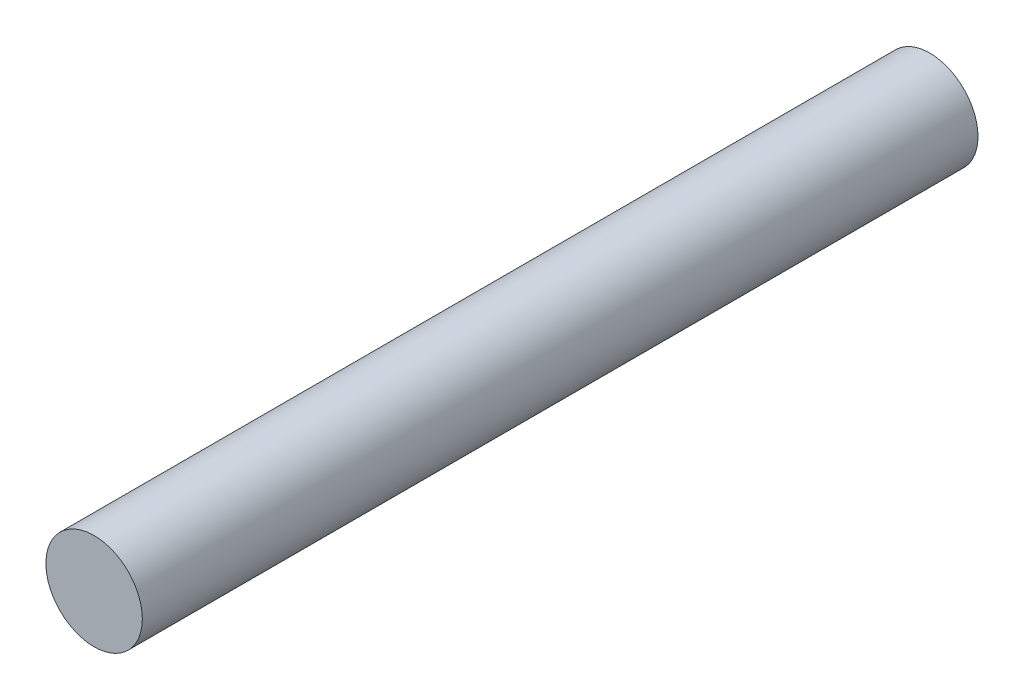
ISO-10303-21;
HEADER;
FILE_DESCRIPTION(('STEP AP214'),'2;1');
FILE_NAME('part.step','',(''),(''),'','','');
FILE_SCHEMA(('AUTOMOTIVE_DESIGN { 1 0 10303 214 1 1 1 1 }'));
ENDSEC;
DATA;
#1=APPLICATION_CONTEXT('core data for automotive mechanical design processes');
#2=APPLICATION_PROTOCOL_DEFINITION('international standard','automotive_design',2000,#1);
#3=PRODUCT_CONTEXT('',#1,'mechanical');
#4=PRODUCT('Part','Part','',(#3));
#5=PRODUCT_RELATED_PRODUCT_CATEGORY('part','',(#4));
#6=PRODUCT_DEFINITION_FORMATION('','',#4);
#7=PRODUCT_DEFINITION_CONTEXT('part definition',#1,'design');
#8=PRODUCT_DEFINITION('design','',#6,#7);
#9=PRODUCT_DEFINITION_SHAPE('','',#8);
#10=(LENGTH_UNIT() NAMED_UNIT(*) SI_UNIT(.MILLI.,.METRE.));
#11=(NAMED_UNIT(*) PLANE_ANGLE_UNIT() SI_UNIT($,.RADIAN.));
#12=(NAMED_UNIT(*) SI_UNIT($,.STERADIAN.) SOLID_ANGLE_UNIT());
#13=UNCERTAINTY_MEASURE_WITH_UNIT(LENGTH_MEASURE(1.E-05),#10,'distance_accuracy_value','');
#14=(GEOMETRIC_REPRESENTATION_CONTEXT(3) GLOBAL_UNCERTAINTY_ASSIGNED_CONTEXT((#13)) GLOBAL_UNIT_ASSIGNED_CONTEXT((#10,
#11,#12)) REPRESENTATION_CONTEXT('',''));
#15=CARTESIAN_POINT('',(0.,0.,0.));
#16=DIRECTION('',(0.,0.,1.));
#17=DIRECTION('',(1.,0.,0.));
#18=AXIS2_PLACEMENT_3D('',#15,#16,#17);
#19=CARTESIAN_POINT('',(0.,0.,130.));
#20=DIRECTION('',(0.,0.,-1.));
#21=DIRECTION('',(-1.,0.,0.));
#22=AXIS2_PLACEMENT_3D('',#19,#20,#21);
#23=CYLINDRICAL_SURFACE('',#22,7.5);
#24=CARTESIAN_POINT('',(0.,0.,130.));
#25=DIRECTION('',(0.,0.,1.));
#26=DIRECTION('',(1.,0.,0.));
#27=AXIS2_PLACEMENT_3D('',#24,#25,#26);
#28=CIRCLE('',#27,7.5);
#29=CARTESIAN_POINT('',(7.5,0.,130.));
#30=VERTEX_POINT('',#29);
#31=EDGE_CURVE('E10',#30,#30,#28,.T.);
#32=ORIENTED_EDGE('',*,*,#31,.F.);
#33=EDGE_LOOP('',(#32));
#34=FACE_BOUND('',#33,.T.);
#35=CARTESIAN_POINT('',(0.,0.,0.));
#36=DIRECTION('',(0.,0.,1.));
#37=DIRECTION('',(1.,0.,0.));
#38=AXIS2_PLACEMENT_3D('',#35,#36,#37);
#39=CIRCLE('',#38,7.5);
#40=CARTESIAN_POINT('',(7.5,0.,0.));
#41=VERTEX_POINT('',#40);
#42=EDGE_CURVE('E44',#41,#41,#39,.T.);
#43=ORIENTED_EDGE('',*,*,#42,.T.);
#44=EDGE_LOOP('',(#43));
#45=FACE_BOUND('',#44,.T.);
#46=ADVANCED_FACE('F41',(#34,#45),#23,.T.);
#47=CARTESIAN_POINT('',(0.,0.,130.));
#48=DIRECTION('',(0.,0.,1.));
#49=DIRECTION('',(1.,0.,0.));
#50=AXIS2_PLACEMENT_3D('',#47,#48,#49);
#51=PLANE('',#50);
#52=ORIENTED_EDGE('',*,*,#31,.T.);
#53=EDGE_LOOP('',(#52));
#54=FACE_BOUND('',#53,.T.);
#55=ADVANCED_FACE('F58',(#54),#51,.T.);
#56=CARTESIAN_POINT('',(0.,0.,0.));
#57=DIRECTION('',(0.,0.,1.));
#58=DIRECTION('',(1.,0.,0.));
#59=AXIS2_PLACEMENT_3D('',#56,#57,#58);
#60=PLANE('',#59);
#61=ORIENTED_EDGE('',*,*,#42,.F.);
#62=EDGE_LOOP('',(#61));
#63=FACE_BOUND('',#62,.T.);
#64=ADVANCED_FACE('F56',(#63),#60,.F.);
#65=CLOSED_SHELL('',(#46,#55,#64));
#66=MANIFOLD_SOLID_BREP('B2',#65);
#67=ADVANCED_BREP_SHAPE_REPRESENTATION('',(#18,#66),#14);
#68=SHAPE_DEFINITION_REPRESENTATION(#9,#67);
ENDSEC;
END-ISO-10303-21;
